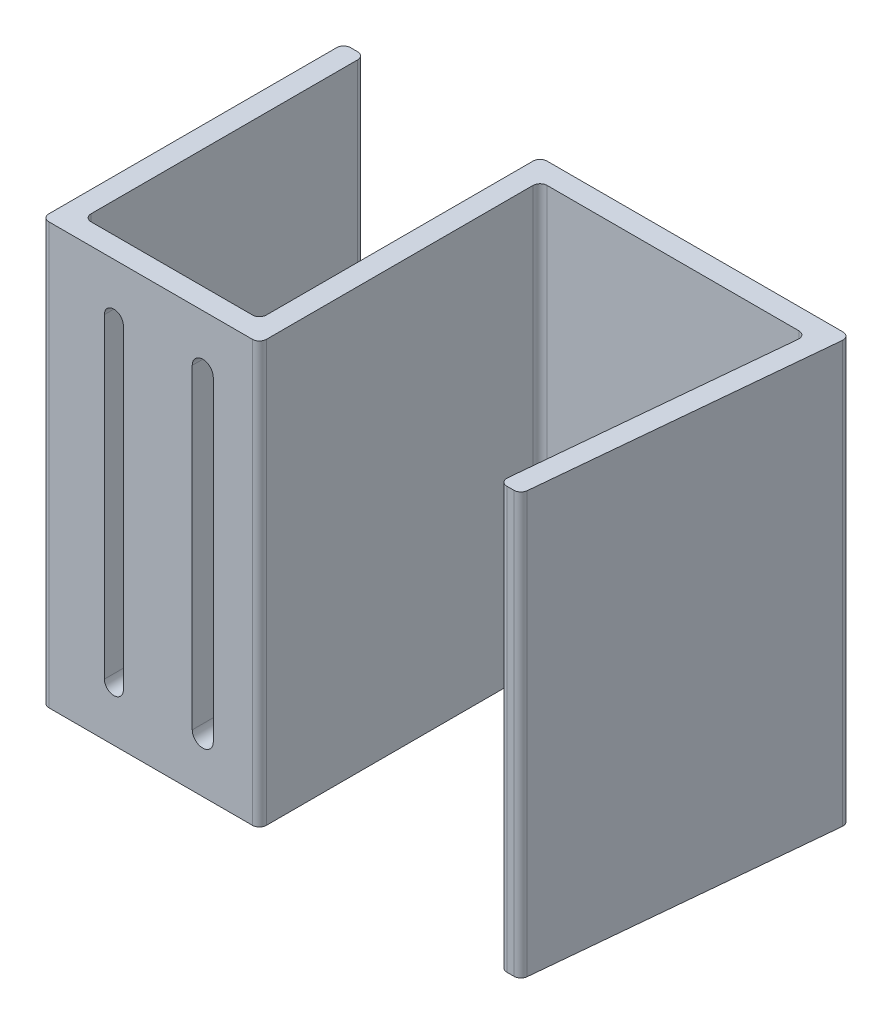
ISO-10303-21;
HEADER;
FILE_DESCRIPTION(('STEP AP214'),'2;1');
FILE_NAME('part.step','',(''),(''),'','','');
FILE_SCHEMA(('AUTOMOTIVE_DESIGN { 1 0 10303 214 1 1 1 1 }'));
ENDSEC;
DATA;
#1=APPLICATION_CONTEXT('core data for automotive mechanical design processes');
#2=APPLICATION_PROTOCOL_DEFINITION('international standard','automotive_design',2000,#1);
#3=PRODUCT_CONTEXT('',#1,'mechanical');
#4=PRODUCT('Part','Part','',(#3));
#5=PRODUCT_RELATED_PRODUCT_CATEGORY('part','',(#4));
#6=PRODUCT_DEFINITION_FORMATION('','',#4);
#7=PRODUCT_DEFINITION_CONTEXT('part definition',#1,'design');
#8=PRODUCT_DEFINITION('design','',#6,#7);
#9=PRODUCT_DEFINITION_SHAPE('','',#8);
#10=(LENGTH_UNIT() NAMED_UNIT(*) SI_UNIT(.MILLI.,.METRE.));
#11=(NAMED_UNIT(*) PLANE_ANGLE_UNIT() SI_UNIT($,.RADIAN.));
#12=(NAMED_UNIT(*) SI_UNIT($,.STERADIAN.) SOLID_ANGLE_UNIT());
#13=UNCERTAINTY_MEASURE_WITH_UNIT(LENGTH_MEASURE(1.E-05),#10,'distance_accuracy_value','');
#14=(GEOMETRIC_REPRESENTATION_CONTEXT(3) GLOBAL_UNCERTAINTY_ASSIGNED_CONTEXT((#13)) GLOBAL_UNIT_ASSIGNED_CONTEXT((#10,
#11,#12)) REPRESENTATION_CONTEXT('',''));
#15=CARTESIAN_POINT('',(0.,0.,0.));
#16=DIRECTION('',(0.,0.,1.));
#17=DIRECTION('',(1.,0.,0.));
#18=AXIS2_PLACEMENT_3D('',#15,#16,#17);
#19=CARTESIAN_POINT('',(-52.9607843137255,60.,19.5168179250331));
#20=DIRECTION('',(0.,0.,-1.));
#21=DIRECTION('',(-1.,0.,0.));
#22=AXIS2_PLACEMENT_3D('',#19,#20,#21);
#23=PLANE('',#22);
#24=DIRECTION('',(1.,0.,0.));
#25=VECTOR('',#24,1.);
#26=CARTESIAN_POINT('',(-52.9607843137255,60.,19.5168179250331));
#27=LINE('',#26,#25);
#28=CARTESIAN_POINT('',(-51.9607843137255,60.,19.5168179250331));
#29=VERTEX_POINT('',#28);
#30=CARTESIAN_POINT('',(-22.9607843137255,60.,19.5168179250331));
#31=VERTEX_POINT('',#30);
#32=EDGE_CURVE('E321',#29,#31,#27,.T.);
#33=ORIENTED_EDGE('',*,*,#32,.F.);
#34=DIRECTION('',(0.,-1.,0.));
#35=VECTOR('',#34,1.);
#36=CARTESIAN_POINT('',(-51.9607843137255,60.,19.5168179250331));
#37=LINE('',#36,#35);
#38=CARTESIAN_POINT('',(-51.9607843137255,0.,19.5168179250331));
#39=VERTEX_POINT('',#38);
#40=EDGE_CURVE('E461',#29,#39,#37,.T.);
#41=ORIENTED_EDGE('',*,*,#40,.T.);
#42=DIRECTION('',(1.,0.,0.));
#43=VECTOR('',#42,1.);
#44=CARTESIAN_POINT('',(-52.9607843137255,0.,19.5168179250331));
#45=LINE('',#44,#43);
#46=CARTESIAN_POINT('',(-22.9607843137255,0.,19.5168179250331));
#47=VERTEX_POINT('',#46);
#48=EDGE_CURVE('E320',#39,#47,#45,.T.);
#49=ORIENTED_EDGE('',*,*,#48,.T.);
#50=DIRECTION('',(0.,-1.,0.));
#51=VECTOR('',#50,1.);
#52=CARTESIAN_POINT('',(-22.9607843137255,60.,19.5168179250331));
#53=LINE('',#52,#51);
#54=EDGE_CURVE('E458',#47,#31,#53,.F.);
#55=ORIENTED_EDGE('',*,*,#54,.T.);
#56=EDGE_LOOP('',(#33,#41,#49,#55));
#57=FACE_BOUND('',#56,.T.);
#58=DIRECTION('',(0.,1.,0.));
#59=VECTOR('',#58,1.);
#60=CARTESIAN_POINT('',(-41.358290675916,60.,19.5168179250331));
#61=LINE('',#60,#59);
#62=CARTESIAN_POINT('',(-41.358290675916,7.5,19.5168179250331));
#63=VERTEX_POINT('',#62);
#64=CARTESIAN_POINT('',(-41.358290675916,52.5,19.5168179250331));
#65=VERTEX_POINT('',#64);
#66=EDGE_CURVE('E313',#63,#65,#61,.T.);
#67=ORIENTED_EDGE('',*,*,#66,.F.);
#68=CARTESIAN_POINT('',(-42.711362899011,7.5,19.5168179250331));
#69=DIRECTION('',(0.,0.,-1.));
#70=DIRECTION('',(-1.,0.,0.));
#71=AXIS2_PLACEMENT_3D('',#68,#69,#70);
#72=CIRCLE('',#71,1.353072223095);
#73=CARTESIAN_POINT('',(-44.064435122106,7.5,19.5168179250331));
#74=VERTEX_POINT('',#73);
#75=EDGE_CURVE('E316',#63,#74,#72,.T.);
#76=ORIENTED_EDGE('',*,*,#75,.T.);
#77=DIRECTION('',(0.,1.,0.));
#78=VECTOR('',#77,1.);
#79=CARTESIAN_POINT('',(-44.064435122106,60.,19.5168179250331));
#80=LINE('',#79,#78);
#81=CARTESIAN_POINT('',(-44.064435122106,52.5,19.5168179250331));
#82=VERTEX_POINT('',#81);
#83=EDGE_CURVE('E296',#74,#82,#80,.T.);
#84=ORIENTED_EDGE('',*,*,#83,.T.);
#85=CARTESIAN_POINT('',(-42.711362899011,52.5,19.5168179250331));
#86=DIRECTION('',(0.,0.,-1.));
#87=DIRECTION('',(-1.,0.,0.));
#88=AXIS2_PLACEMENT_3D('',#85,#86,#87);
#89=CIRCLE('',#88,1.353072223095);
#90=EDGE_CURVE('E309',#82,#65,#89,.T.);
#91=ORIENTED_EDGE('',*,*,#90,.T.);
#92=EDGE_LOOP('',(#67,#76,#84,#91));
#93=FACE_BOUND('',#92,.T.);
#94=CARTESIAN_POINT('',(-30.0386818856317,7.5,19.5168179250331));
#95=DIRECTION('',(0.,0.,-1.));
#96=DIRECTION('',(-1.,0.,0.));
#97=AXIS2_PLACEMENT_3D('',#94,#95,#96);
#98=CIRCLE('',#97,1.5);
#99=CARTESIAN_POINT('',(-31.5386818856317,7.5,19.5168179250331));
#100=VERTEX_POINT('',#99);
#101=CARTESIAN_POINT('',(-28.5386818856317,7.5,19.5168179250331));
#102=VERTEX_POINT('',#101);
#103=EDGE_CURVE('E271',#100,#102,#98,.F.);
#104=ORIENTED_EDGE('',*,*,#103,.F.);
#105=DIRECTION('',(0.,-1.,0.));
#106=VECTOR('',#105,1.);
#107=CARTESIAN_POINT('',(-31.5386818856317,60.,19.5168179250331));
#108=LINE('',#107,#106);
#109=CARTESIAN_POINT('',(-31.5386818856317,52.5,19.5168179250331));
#110=VERTEX_POINT('',#109);
#111=EDGE_CURVE('E267',#110,#100,#108,.T.);
#112=ORIENTED_EDGE('',*,*,#111,.F.);
#113=CARTESIAN_POINT('',(-30.0386818856317,52.5,19.5168179250331));
#114=DIRECTION('',(0.,0.,-1.));
#115=DIRECTION('',(-1.,0.,0.));
#116=AXIS2_PLACEMENT_3D('',#113,#114,#115);
#117=CIRCLE('',#116,1.5);
#118=CARTESIAN_POINT('',(-28.5386818856317,52.5,19.5168179250331));
#119=VERTEX_POINT('',#118);
#120=EDGE_CURVE('E253',#119,#110,#117,.F.);
#121=ORIENTED_EDGE('',*,*,#120,.F.);
#122=DIRECTION('',(0.,-1.,0.));
#123=VECTOR('',#122,1.);
#124=CARTESIAN_POINT('',(-28.5386818856317,60.,19.5168179250331));
#125=LINE('',#124,#123);
#126=EDGE_CURVE('E247',#119,#102,#125,.T.);
#127=ORIENTED_EDGE('',*,*,#126,.T.);
#128=EDGE_LOOP('',(#104,#112,#121,#127));
#129=FACE_BOUND('',#128,.T.);
#130=ADVANCED_FACE('F41',(#57,#93,#129),#23,.F.);
#131=CARTESIAN_POINT('',(-24.9607843137255,60.,16.5168179250331));
#132=DIRECTION('',(0.,0.,1.));
#133=DIRECTION('',(1.,0.,0.));
#134=AXIS2_PLACEMENT_3D('',#131,#132,#133);
#135=PLANE('',#134);
#136=DIRECTION('',(-1.,0.,0.));
#137=VECTOR('',#136,1.);
#138=CARTESIAN_POINT('',(-24.9607843137255,0.,16.5168179250331));
#139=LINE('',#138,#137);
#140=CARTESIAN_POINT('',(-25.9607843137255,0.,16.5168179250331));
#141=VERTEX_POINT('',#140);
#142=CARTESIAN_POINT('',(-48.9607843137255,0.,16.5168179250331));
#143=VERTEX_POINT('',#142);
#144=EDGE_CURVE('E402',#141,#143,#139,.T.);
#145=ORIENTED_EDGE('',*,*,#144,.T.);
#146=DIRECTION('',(0.,-1.,0.));
#147=VECTOR('',#146,1.);
#148=CARTESIAN_POINT('',(-48.9607843137255,60.,16.5168179250331));
#149=LINE('',#148,#147);
#150=CARTESIAN_POINT('',(-48.9607843137255,60.,16.5168179250331));
#151=VERTEX_POINT('',#150);
#152=EDGE_CURVE('E448',#143,#151,#149,.F.);
#153=ORIENTED_EDGE('',*,*,#152,.T.);
#154=DIRECTION('',(-1.,0.,0.));
#155=VECTOR('',#154,1.);
#156=CARTESIAN_POINT('',(-24.9607843137255,60.,16.5168179250331));
#157=LINE('',#156,#155);
#158=CARTESIAN_POINT('',(-25.9607843137255,60.,16.5168179250331));
#159=VERTEX_POINT('',#158);
#160=EDGE_CURVE('E354',#159,#151,#157,.T.);
#161=ORIENTED_EDGE('',*,*,#160,.F.);
#162=DIRECTION('',(0.,-1.,0.));
#163=VECTOR('',#162,1.);
#164=CARTESIAN_POINT('',(-25.9607843137255,0.,16.5168179250331));
#165=LINE('',#164,#163);
#166=EDGE_CURVE('E444',#159,#141,#165,.T.);
#167=ORIENTED_EDGE('',*,*,#166,.T.);
#168=EDGE_LOOP('',(#145,#153,#161,#167));
#169=FACE_BOUND('',#168,.T.);
#170=DIRECTION('',(0.,1.,0.));
#171=VECTOR('',#170,1.);
#172=CARTESIAN_POINT('',(-44.064435122106,7.5,16.5168179250331));
#173=LINE('',#172,#171);
#174=CARTESIAN_POINT('',(-44.064435122106,7.5,16.5168179250331));
#175=VERTEX_POINT('',#174);
#176=CARTESIAN_POINT('',(-44.064435122106,52.5,16.5168179250331));
#177=VERTEX_POINT('',#176);
#178=EDGE_CURVE('E280',#175,#177,#173,.T.);
#179=ORIENTED_EDGE('',*,*,#178,.F.);
#180=CARTESIAN_POINT('',(-42.711362899011,7.5,16.5168179250331));
#181=DIRECTION('',(0.,0.,-1.));
#182=DIRECTION('',(-1.,0.,0.));
#183=AXIS2_PLACEMENT_3D('',#180,#181,#182);
#184=CIRCLE('',#183,1.353072223095);
#185=CARTESIAN_POINT('',(-41.358290675916,7.5,16.5168179250331));
#186=VERTEX_POINT('',#185);
#187=EDGE_CURVE('E277',#186,#175,#184,.T.);
#188=ORIENTED_EDGE('',*,*,#187,.F.);
#189=DIRECTION('',(0.,1.,0.));
#190=VECTOR('',#189,1.);
#191=CARTESIAN_POINT('',(-41.358290675916,7.5,16.5168179250331));
#192=LINE('',#191,#190);
#193=CARTESIAN_POINT('',(-41.358290675916,52.5,16.5168179250331));
#194=VERTEX_POINT('',#193);
#195=EDGE_CURVE('E288',#186,#194,#192,.T.);
#196=ORIENTED_EDGE('',*,*,#195,.T.);
#197=CARTESIAN_POINT('',(-42.711362899011,52.5,16.5168179250331));
#198=DIRECTION('',(0.,0.,-1.));
#199=DIRECTION('',(-1.,0.,0.));
#200=AXIS2_PLACEMENT_3D('',#197,#198,#199);
#201=CIRCLE('',#200,1.353072223095);
#202=EDGE_CURVE('E284',#177,#194,#201,.T.);
#203=ORIENTED_EDGE('',*,*,#202,.F.);
#204=EDGE_LOOP('',(#179,#188,#196,#203));
#205=FACE_BOUND('',#204,.T.);
#206=CARTESIAN_POINT('',(-30.0386818856317,7.5,16.5168179250331));
#207=DIRECTION('',(0.,0.,1.));
#208=DIRECTION('',(1.,0.,0.));
#209=AXIS2_PLACEMENT_3D('',#206,#207,#208);
#210=CIRCLE('',#209,1.5);
#211=CARTESIAN_POINT('',(-28.5386818856317,7.5,16.5168179250331));
#212=VERTEX_POINT('',#211);
#213=CARTESIAN_POINT('',(-31.5386818856317,7.5,16.5168179250331));
#214=VERTEX_POINT('',#213);
#215=EDGE_CURVE('E12',#212,#214,#210,.F.);
#216=ORIENTED_EDGE('',*,*,#215,.F.);
#217=DIRECTION('',(0.,1.,0.));
#218=VECTOR('',#217,1.);
#219=CARTESIAN_POINT('',(-28.5386818856317,60.,16.5168179250331));
#220=LINE('',#219,#218);
#221=CARTESIAN_POINT('',(-28.5386818856317,52.5,16.5168179250331));
#222=VERTEX_POINT('',#221);
#223=EDGE_CURVE('E572',#212,#222,#220,.T.);
#224=ORIENTED_EDGE('',*,*,#223,.T.);
#225=CARTESIAN_POINT('',(-30.0386818856317,52.5,16.5168179250331));
#226=DIRECTION('',(0.,0.,1.));
#227=DIRECTION('',(1.,0.,0.));
#228=AXIS2_PLACEMENT_3D('',#225,#226,#227);
#229=CIRCLE('',#228,1.5);
#230=CARTESIAN_POINT('',(-31.5386818856317,52.5,16.5168179250331));
#231=VERTEX_POINT('',#230);
#232=EDGE_CURVE('E261',#231,#222,#229,.F.);
#233=ORIENTED_EDGE('',*,*,#232,.F.);
#234=DIRECTION('',(0.,1.,0.));
#235=VECTOR('',#234,1.);
#236=CARTESIAN_POINT('',(-31.5386818856317,60.,16.5168179250331));
#237=LINE('',#236,#235);
#238=EDGE_CURVE('E50',#214,#231,#237,.T.);
#239=ORIENTED_EDGE('',*,*,#238,.F.);
#240=EDGE_LOOP('',(#216,#224,#233,#239));
#241=FACE_BOUND('',#240,.T.);
#242=ADVANCED_FACE('F586',(#169,#205,#241),#135,.F.);
#243=CARTESIAN_POINT('',(-21.9607843137255,60.,19.5168179250331));
#244=DIRECTION('',(-1.,0.,0.));
#245=DIRECTION('',(0.,0.,1.));
#246=AXIS2_PLACEMENT_3D('',#243,#244,#245);
#247=PLANE('',#246);
#248=DIRECTION('',(0.,0.,-1.));
#249=VECTOR('',#248,1.);
#250=CARTESIAN_POINT('',(-21.9607843137255,0.,19.5168179250331));
#251=LINE('',#250,#249);
#252=CARTESIAN_POINT('',(-21.9607843137255,0.,18.5168179250331));
#253=VERTEX_POINT('',#252);
#254=CARTESIAN_POINT('',(-21.9607843137255,0.,-19.4831820749669));
#255=VERTEX_POINT('',#254);
#256=EDGE_CURVE('E374',#253,#255,#251,.T.);
#257=ORIENTED_EDGE('',*,*,#256,.T.);
#258=DIRECTION('',(0.,-1.,0.));
#259=VECTOR('',#258,1.);
#260=CARTESIAN_POINT('',(-21.9607843137255,60.,-19.4831820749669));
#261=LINE('',#260,#259);
#262=CARTESIAN_POINT('',(-21.9607843137255,60.,-19.4831820749669));
#263=VERTEX_POINT('',#262);
#264=EDGE_CURVE('E434',#255,#263,#261,.F.);
#265=ORIENTED_EDGE('',*,*,#264,.T.);
#266=DIRECTION('',(0.,0.,-1.));
#267=VECTOR('',#266,1.);
#268=CARTESIAN_POINT('',(-21.9607843137255,60.,19.5168179250331));
#269=LINE('',#268,#267);
#270=CARTESIAN_POINT('',(-21.9607843137255,60.,18.5168179250331));
#271=VERTEX_POINT('',#270);
#272=EDGE_CURVE('E325',#271,#263,#269,.T.);
#273=ORIENTED_EDGE('',*,*,#272,.F.);
#274=DIRECTION('',(0.,-1.,0.));
#275=VECTOR('',#274,1.);
#276=CARTESIAN_POINT('',(-21.9607843137255,60.,18.5168179250331));
#277=LINE('',#276,#275);
#278=EDGE_CURVE('E430',#271,#253,#277,.T.);
#279=ORIENTED_EDGE('',*,*,#278,.T.);
#280=EDGE_LOOP('',(#257,#265,#273,#279));
#281=FACE_BOUND('',#280,.T.);
#282=ADVANCED_FACE('F610',(#281),#247,.F.);
#283=CARTESIAN_POINT('',(-21.9607843137255,60.,-20.4831820749669));
#284=DIRECTION('',(0.,0.,-1.));
#285=DIRECTION('',(-1.,0.,0.));
#286=AXIS2_PLACEMENT_3D('',#283,#284,#285);
#287=PLANE('',#286);
#288=DIRECTION('',(1.,0.,0.));
#289=VECTOR('',#288,1.);
#290=CARTESIAN_POINT('',(-21.9607843137255,0.,-20.4831820749669));
#291=LINE('',#290,#289);
#292=CARTESIAN_POINT('',(-20.9607843137255,0.,-20.4831820749669));
#293=VERTEX_POINT('',#292);
#294=CARTESIAN_POINT('',(14.9392649412884,0.,-20.4831820749669));
#295=VERTEX_POINT('',#294);
#296=EDGE_CURVE('E378',#293,#295,#291,.T.);
#297=ORIENTED_EDGE('',*,*,#296,.T.);
#298=DIRECTION('',(0.,-1.,0.));
#299=VECTOR('',#298,1.);
#300=CARTESIAN_POINT('',(14.9392649412884,60.,-20.4831820749669));
#301=LINE('',#300,#299);
#302=CARTESIAN_POINT('',(14.9392649412884,60.,-20.4831820749669));
#303=VERTEX_POINT('',#302);
#304=EDGE_CURVE('E427',#295,#303,#301,.F.);
#305=ORIENTED_EDGE('',*,*,#304,.T.);
#306=DIRECTION('',(1.,0.,0.));
#307=VECTOR('',#306,1.);
#308=CARTESIAN_POINT('',(-21.9607843137255,60.,-20.4831820749669));
#309=LINE('',#308,#307);
#310=CARTESIAN_POINT('',(-20.9607843137255,60.,-20.4831820749669));
#311=VERTEX_POINT('',#310);
#312=EDGE_CURVE('E330',#311,#303,#309,.T.);
#313=ORIENTED_EDGE('',*,*,#312,.F.);
#314=DIRECTION('',(0.,-1.,0.));
#315=VECTOR('',#314,1.);
#316=CARTESIAN_POINT('',(-20.9607843137255,0.,-20.4831820749669));
#317=LINE('',#316,#315);
#318=EDGE_CURVE('E423',#311,#293,#317,.T.);
#319=ORIENTED_EDGE('',*,*,#318,.T.);
#320=EDGE_LOOP('',(#297,#305,#313,#319));
#321=FACE_BOUND('',#320,.T.);
#322=ADVANCED_FACE('F699',(#321),#287,.F.);
#323=CARTESIAN_POINT('',(16.0392156862745,60.,-20.4831820749669));
#324=DIRECTION('',(0.995479347839446,0.,0.0949782502742146));
#325=DIRECTION('',(0.0949782502742146,0.,-0.995479347839446));
#326=AXIS2_PLACEMENT_3D('',#323,#324,#325);
#327=PLANE('',#326);
#328=DIRECTION('',(-0.0949782502742146,0.,0.995479347839446));
#329=VECTOR('',#328,1.);
#330=CARTESIAN_POINT('',(16.0392156862745,60.,-20.4831820749669));
#331=LINE('',#330,#329);
#332=CARTESIAN_POINT('',(15.9347442891279,60.,-19.3882038246927));
#333=VERTEX_POINT('',#332);
#334=CARTESIAN_POINT('',(12.3273045344369,60.,18.4218396747588));
#335=VERTEX_POINT('',#334);
#336=EDGE_CURVE('E334',#333,#335,#331,.T.);
#337=ORIENTED_EDGE('',*,*,#336,.F.);
#338=DIRECTION('',(0.,-1.,0.));
#339=VECTOR('',#338,1.);
#340=CARTESIAN_POINT('',(15.9347442891279,0.,-19.3882038246927));
#341=LINE('',#340,#339);
#342=CARTESIAN_POINT('',(15.9347442891279,0.,-19.3882038246927));
#343=VERTEX_POINT('',#342);
#344=EDGE_CURVE('E419',#333,#343,#341,.T.);
#345=ORIENTED_EDGE('',*,*,#344,.T.);
#346=DIRECTION('',(-0.0949782502742146,0.,0.995479347839446));
#347=VECTOR('',#346,1.);
#348=CARTESIAN_POINT('',(16.0392156862745,0.,-20.4831820749669));
#349=LINE('',#348,#347);
#350=CARTESIAN_POINT('',(12.3273045344369,0.,18.4218396747588));
#351=VERTEX_POINT('',#350);
#352=EDGE_CURVE('E382',#343,#351,#349,.T.);
#353=ORIENTED_EDGE('',*,*,#352,.T.);
#354=DIRECTION('',(0.,-1.,0.));
#355=VECTOR('',#354,1.);
#356=CARTESIAN_POINT('',(12.3273045344369,60.,18.4218396747588));
#357=LINE('',#356,#355);
#358=EDGE_CURVE('E370',#351,#335,#357,.F.);
#359=ORIENTED_EDGE('',*,*,#358,.T.);
#360=EDGE_LOOP('',(#337,#345,#353,#359));
#361=FACE_BOUND('',#360,.T.);
#362=ADVANCED_FACE('F706',(#361),#327,.F.);
#363=CARTESIAN_POINT('',(12.2228331372903,60.,19.5168179250331));
#364=DIRECTION('',(0.,0.,-1.));
#365=DIRECTION('',(-1.,0.,0.));
#366=AXIS2_PLACEMENT_3D('',#363,#364,#365);
#367=PLANE('',#366);
#368=DIRECTION('',(1.,0.,0.));
#369=VECTOR('',#368,1.);
#370=CARTESIAN_POINT('',(12.2228331372903,0.,19.5168179250331));
#371=LINE('',#370,#369);
#372=CARTESIAN_POINT('',(13.3227838822764,0.,19.5168179250331));
#373=VERTEX_POINT('',#372);
#374=CARTESIAN_POINT('',(14.3137015197535,0.,19.5168179250331));
#375=VERTEX_POINT('',#374);
#376=EDGE_CURVE('E386',#373,#375,#371,.T.);
#377=ORIENTED_EDGE('',*,*,#376,.T.);
#378=DIRECTION('',(0.,-1.,0.));
#379=VECTOR('',#378,1.);
#380=CARTESIAN_POINT('',(14.3137015197535,60.,19.5168179250331));
#381=LINE('',#380,#379);
#382=CARTESIAN_POINT('',(14.3137015197535,60.,19.5168179250331));
#383=VERTEX_POINT('',#382);
#384=EDGE_CURVE('E531',#375,#383,#381,.F.);
#385=ORIENTED_EDGE('',*,*,#384,.T.);
#386=DIRECTION('',(1.,0.,0.));
#387=VECTOR('',#386,1.);
#388=CARTESIAN_POINT('',(12.2228331372903,60.,19.5168179250331));
#389=LINE('',#388,#387);
#390=CARTESIAN_POINT('',(13.3227838822764,60.,19.5168179250331));
#391=VERTEX_POINT('',#390);
#392=EDGE_CURVE('E338',#391,#383,#389,.T.);
#393=ORIENTED_EDGE('',*,*,#392,.F.);
#394=DIRECTION('',(0.,-1.,0.));
#395=VECTOR('',#394,1.);
#396=CARTESIAN_POINT('',(13.3227838822764,60.,19.5168179250331));
#397=LINE('',#396,#395);
#398=EDGE_CURVE('E527',#391,#373,#397,.T.);
#399=ORIENTED_EDGE('',*,*,#398,.T.);
#400=EDGE_LOOP('',(#377,#385,#393,#399));
#401=FACE_BOUND('',#400,.T.);
#402=ADVANCED_FACE('F713',(#401),#367,.F.);
#403=CARTESIAN_POINT('',(15.2228331372903,60.,19.5168179250331));
#404=DIRECTION('',(-0.995479347839446,0.,-0.0949782502742145));
#405=DIRECTION('',(-0.0949782502742145,0.,0.995479347839446));
#406=AXIS2_PLACEMENT_3D('',#403,#404,#405);
#407=PLANE('',#406);
#408=DIRECTION('',(0.0949782502742145,0.,-0.995479347839446));
#409=VECTOR('',#408,1.);
#410=CARTESIAN_POINT('',(15.2228331372903,60.,19.5168179250331));
#411=LINE('',#410,#409);
#412=CARTESIAN_POINT('',(15.309180867593,60.,18.6117961753073));
#413=VERTEX_POINT('',#412);
#414=CARTESIAN_POINT('',(19.2209729803017,60.,-22.3882038246927));
#415=VERTEX_POINT('',#414);
#416=EDGE_CURVE('E342',#413,#415,#411,.T.);
#417=ORIENTED_EDGE('',*,*,#416,.F.);
#418=DIRECTION('',(0.,-1.,0.));
#419=VECTOR('',#418,1.);
#420=CARTESIAN_POINT('',(15.309180867593,60.,18.6117961753073));
#421=LINE('',#420,#419);
#422=CARTESIAN_POINT('',(15.309180867593,0.,18.6117961753073));
#423=VERTEX_POINT('',#422);
#424=EDGE_CURVE('E523',#413,#423,#421,.T.);
#425=ORIENTED_EDGE('',*,*,#424,.T.);
#426=DIRECTION('',(0.0949782502742145,0.,-0.995479347839446));
#427=VECTOR('',#426,1.);
#428=CARTESIAN_POINT('',(15.2228331372903,0.,19.5168179250331));
#429=LINE('',#428,#427);
#430=CARTESIAN_POINT('',(19.2209729803017,0.,-22.3882038246927));
#431=VERTEX_POINT('',#430);
#432=EDGE_CURVE('E390',#423,#431,#429,.T.);
#433=ORIENTED_EDGE('',*,*,#432,.T.);
#434=DIRECTION('',(0.,-1.,0.));
#435=VECTOR('',#434,1.);
#436=CARTESIAN_POINT('',(19.2209729803017,60.,-22.3882038246927));
#437=LINE('',#436,#435);
#438=EDGE_CURVE('E520',#431,#415,#437,.F.);
#439=ORIENTED_EDGE('',*,*,#438,.T.);
#440=EDGE_LOOP('',(#417,#425,#433,#439));
#441=FACE_BOUND('',#440,.T.);
#442=ADVANCED_FACE('F720',(#441),#407,.F.);
#443=CARTESIAN_POINT('',(19.3254443774483,60.,-23.4831820749669));
#444=DIRECTION('',(0.,0.,1.));
#445=DIRECTION('',(1.,0.,0.));
#446=AXIS2_PLACEMENT_3D('',#443,#444,#445);
#447=PLANE('',#446);
#448=DIRECTION('',(-1.,0.,0.));
#449=VECTOR('',#448,1.);
#450=CARTESIAN_POINT('',(19.3254443774483,60.,-23.4831820749669));
#451=LINE('',#450,#449);
#452=CARTESIAN_POINT('',(18.2254936324623,60.,-23.4831820749669));
#453=VERTEX_POINT('',#452);
#454=CARTESIAN_POINT('',(-23.9607843137255,60.,-23.4831820749669));
#455=VERTEX_POINT('',#454);
#456=EDGE_CURVE('E346',#453,#455,#451,.T.);
#457=ORIENTED_EDGE('',*,*,#456,.F.);
#458=DIRECTION('',(0.,-1.,0.));
#459=VECTOR('',#458,1.);
#460=CARTESIAN_POINT('',(18.2254936324623,60.,-23.4831820749669));
#461=LINE('',#460,#459);
#462=CARTESIAN_POINT('',(18.2254936324623,0.,-23.4831820749669));
#463=VERTEX_POINT('',#462);
#464=EDGE_CURVE('E537',#453,#463,#461,.T.);
#465=ORIENTED_EDGE('',*,*,#464,.T.);
#466=DIRECTION('',(-1.,0.,0.));
#467=VECTOR('',#466,1.);
#468=CARTESIAN_POINT('',(19.3254443774483,0.,-23.4831820749669));
#469=LINE('',#468,#467);
#470=CARTESIAN_POINT('',(-23.9607843137255,0.,-23.4831820749669));
#471=VERTEX_POINT('',#470);
#472=EDGE_CURVE('E394',#463,#471,#469,.T.);
#473=ORIENTED_EDGE('',*,*,#472,.T.);
#474=DIRECTION('',(0.,-1.,0.));
#475=VECTOR('',#474,1.);
#476=CARTESIAN_POINT('',(-23.9607843137255,60.,-23.4831820749669));
#477=LINE('',#476,#475);
#478=EDGE_CURVE('E534',#471,#455,#477,.F.);
#479=ORIENTED_EDGE('',*,*,#478,.T.);
#480=EDGE_LOOP('',(#457,#465,#473,#479));
#481=FACE_BOUND('',#480,.T.);
#482=ADVANCED_FACE('F727',(#481),#447,.F.);
#483=CARTESIAN_POINT('',(-24.9607843137255,60.,-23.4831820749669));
#484=DIRECTION('',(1.,0.,0.));
#485=DIRECTION('',(0.,0.,-1.));
#486=AXIS2_PLACEMENT_3D('',#483,#484,#485);
#487=PLANE('',#486);
#488=DIRECTION('',(0.,0.,1.));
#489=VECTOR('',#488,1.);
#490=CARTESIAN_POINT('',(-24.9607843137255,0.,-23.4831820749669));
#491=LINE('',#490,#489);
#492=CARTESIAN_POINT('',(-24.9607843137255,0.,-22.4831820749669));
#493=VERTEX_POINT('',#492);
#494=CARTESIAN_POINT('',(-24.9607843137255,0.,15.5168179250331));
#495=VERTEX_POINT('',#494);
#496=EDGE_CURVE('E398',#493,#495,#491,.T.);
#497=ORIENTED_EDGE('',*,*,#496,.T.);
#498=DIRECTION('',(0.,-1.,0.));
#499=VECTOR('',#498,1.);
#500=CARTESIAN_POINT('',(-24.9607843137255,60.,15.5168179250331));
#501=LINE('',#500,#499);
#502=CARTESIAN_POINT('',(-24.9607843137255,60.,15.5168179250331));
#503=VERTEX_POINT('',#502);
#504=EDGE_CURVE('E455',#495,#503,#501,.F.);
#505=ORIENTED_EDGE('',*,*,#504,.T.);
#506=DIRECTION('',(0.,0.,1.));
#507=VECTOR('',#506,1.);
#508=CARTESIAN_POINT('',(-24.9607843137255,60.,-23.4831820749669));
#509=LINE('',#508,#507);
#510=CARTESIAN_POINT('',(-24.9607843137255,60.,-22.4831820749669));
#511=VERTEX_POINT('',#510);
#512=EDGE_CURVE('E350',#511,#503,#509,.T.);
#513=ORIENTED_EDGE('',*,*,#512,.F.);
#514=DIRECTION('',(0.,-1.,0.));
#515=VECTOR('',#514,1.);
#516=CARTESIAN_POINT('',(-24.9607843137255,60.,-22.4831820749669));
#517=LINE('',#516,#515);
#518=EDGE_CURVE('E451',#511,#493,#517,.T.);
#519=ORIENTED_EDGE('',*,*,#518,.T.);
#520=EDGE_LOOP('',(#497,#505,#513,#519));
#521=FACE_BOUND('',#520,.T.);
#522=ADVANCED_FACE('F734',(#521),#487,.F.);
#523=CARTESIAN_POINT('',(-49.9607843137255,60.,16.5168179250331));
#524=DIRECTION('',(-1.,0.,0.));
#525=DIRECTION('',(0.,0.,1.));
#526=AXIS2_PLACEMENT_3D('',#523,#524,#525);
#527=PLANE('',#526);
#528=DIRECTION('',(0.,0.,-1.));
#529=VECTOR('',#528,1.);
#530=CARTESIAN_POINT('',(-49.9607843137255,60.,16.5168179250331));
#531=LINE('',#530,#529);
#532=CARTESIAN_POINT('',(-49.9607843137255,60.,15.5168179250331));
#533=VERTEX_POINT('',#532);
#534=CARTESIAN_POINT('',(-49.9607843137255,60.,-22.4831820749669));
#535=VERTEX_POINT('',#534);
#536=EDGE_CURVE('E358',#533,#535,#531,.T.);
#537=ORIENTED_EDGE('',*,*,#536,.F.);
#538=DIRECTION('',(0.,-1.,0.));
#539=VECTOR('',#538,1.);
#540=CARTESIAN_POINT('',(-49.9607843137255,0.,15.5168179250331));
#541=LINE('',#540,#539);
#542=CARTESIAN_POINT('',(-49.9607843137255,0.,15.5168179250331));
#543=VERTEX_POINT('',#542);
#544=EDGE_CURVE('E440',#533,#543,#541,.T.);
#545=ORIENTED_EDGE('',*,*,#544,.T.);
#546=DIRECTION('',(0.,0.,-1.));
#547=VECTOR('',#546,1.);
#548=CARTESIAN_POINT('',(-49.9607843137255,0.,16.5168179250331));
#549=LINE('',#548,#547);
#550=CARTESIAN_POINT('',(-49.9607843137255,0.,-22.4831820749669));
#551=VERTEX_POINT('',#550);
#552=EDGE_CURVE('E406',#543,#551,#549,.T.);
#553=ORIENTED_EDGE('',*,*,#552,.T.);
#554=DIRECTION('',(0.,-1.,0.));
#555=VECTOR('',#554,1.);
#556=CARTESIAN_POINT('',(-49.9607843137255,60.,-22.4831820749669));
#557=LINE('',#556,#555);
#558=EDGE_CURVE('E437',#551,#535,#557,.F.);
#559=ORIENTED_EDGE('',*,*,#558,.T.);
#560=EDGE_LOOP('',(#537,#545,#553,#559));
#561=FACE_BOUND('',#560,.T.);
#562=ADVANCED_FACE('F745',(#561),#527,.F.);
#563=CARTESIAN_POINT('',(-49.9607843137255,60.,-23.4831820749669));
#564=DIRECTION('',(0.,0.,1.));
#565=DIRECTION('',(1.,0.,0.));
#566=AXIS2_PLACEMENT_3D('',#563,#564,#565);
#567=PLANE('',#566);
#568=DIRECTION('',(-1.,0.,0.));
#569=VECTOR('',#568,1.);
#570=CARTESIAN_POINT('',(-49.9607843137255,60.,-23.4831820749669));
#571=LINE('',#570,#569);
#572=CARTESIAN_POINT('',(-50.9607843137255,60.,-23.4831820749669));
#573=VERTEX_POINT('',#572);
#574=CARTESIAN_POINT('',(-51.9607843137255,60.,-23.4831820749669));
#575=VERTEX_POINT('',#574);
#576=EDGE_CURVE('E362',#573,#575,#571,.T.);
#577=ORIENTED_EDGE('',*,*,#576,.F.);
#578=DIRECTION('',(0.,-1.,0.));
#579=VECTOR('',#578,1.);
#580=CARTESIAN_POINT('',(-50.9607843137255,60.,-23.4831820749669));
#581=LINE('',#580,#579);
#582=CARTESIAN_POINT('',(-50.9607843137255,0.,-23.4831820749669));
#583=VERTEX_POINT('',#582);
#584=EDGE_CURVE('E544',#573,#583,#581,.T.);
#585=ORIENTED_EDGE('',*,*,#584,.T.);
#586=DIRECTION('',(-1.,0.,0.));
#587=VECTOR('',#586,1.);
#588=CARTESIAN_POINT('',(-49.9607843137255,0.,-23.4831820749669));
#589=LINE('',#588,#587);
#590=CARTESIAN_POINT('',(-51.9607843137255,0.,-23.4831820749669));
#591=VERTEX_POINT('',#590);
#592=EDGE_CURVE('E410',#583,#591,#589,.T.);
#593=ORIENTED_EDGE('',*,*,#592,.T.);
#594=DIRECTION('',(0.,-1.,0.));
#595=VECTOR('',#594,1.);
#596=CARTESIAN_POINT('',(-51.9607843137255,60.,-23.4831820749669));
#597=LINE('',#596,#595);
#598=EDGE_CURVE('E541',#591,#575,#597,.F.);
#599=ORIENTED_EDGE('',*,*,#598,.T.);
#600=EDGE_LOOP('',(#577,#585,#593,#599));
#601=FACE_BOUND('',#600,.T.);
#602=ADVANCED_FACE('F675',(#601),#567,.F.);
#603=CARTESIAN_POINT('',(-52.9607843137255,60.,-23.4831820749669));
#604=DIRECTION('',(1.,0.,0.));
#605=DIRECTION('',(0.,0.,-1.));
#606=AXIS2_PLACEMENT_3D('',#603,#604,#605);
#607=PLANE('',#606);
#608=DIRECTION('',(0.,0.,1.));
#609=VECTOR('',#608,1.);
#610=CARTESIAN_POINT('',(-52.9607843137255,0.,-23.4831820749669));
#611=LINE('',#610,#609);
#612=CARTESIAN_POINT('',(-52.9607843137255,0.,-22.4831820749669));
#613=VERTEX_POINT('',#612);
#614=CARTESIAN_POINT('',(-52.9607843137255,0.,18.5168179250331));
#615=VERTEX_POINT('',#614);
#616=EDGE_CURVE('E326',#613,#615,#611,.T.);
#617=ORIENTED_EDGE('',*,*,#616,.T.);
#618=DIRECTION('',(0.,-1.,0.));
#619=VECTOR('',#618,1.);
#620=CARTESIAN_POINT('',(-52.9607843137255,60.,18.5168179250331));
#621=LINE('',#620,#619);
#622=CARTESIAN_POINT('',(-52.9607843137255,60.,18.5168179250331));
#623=VERTEX_POINT('',#622);
#624=EDGE_CURVE('E493',#615,#623,#621,.F.);
#625=ORIENTED_EDGE('',*,*,#624,.T.);
#626=DIRECTION('',(0.,0.,1.));
#627=VECTOR('',#626,1.);
#628=CARTESIAN_POINT('',(-52.9607843137255,60.,-23.4831820749669));
#629=LINE('',#628,#627);
#630=CARTESIAN_POINT('',(-52.9607843137255,60.,-22.4831820749669));
#631=VERTEX_POINT('',#630);
#632=EDGE_CURVE('E366',#631,#623,#629,.T.);
#633=ORIENTED_EDGE('',*,*,#632,.F.);
#634=DIRECTION('',(0.,-1.,0.));
#635=VECTOR('',#634,1.);
#636=CARTESIAN_POINT('',(-52.9607843137255,60.,-22.4831820749669));
#637=LINE('',#636,#635);
#638=EDGE_CURVE('E489',#631,#613,#637,.T.);
#639=ORIENTED_EDGE('',*,*,#638,.T.);
#640=EDGE_LOOP('',(#617,#625,#633,#639));
#641=FACE_BOUND('',#640,.T.);
#642=ADVANCED_FACE('F682',(#641),#607,.F.);
#643=CARTESIAN_POINT('',(0.,60.,0.));
#644=DIRECTION('',(0.,1.,0.));
#645=DIRECTION('',(0.,0.,1.));
#646=AXIS2_PLACEMENT_3D('',#643,#644,#645);
#647=PLANE('',#646);
#648=ORIENTED_EDGE('',*,*,#632,.T.);
#649=CARTESIAN_POINT('',(-51.9607843137255,60.,18.5168179250331));
#650=DIRECTION('',(0.,1.,0.));
#651=DIRECTION('',(0.,0.,1.));
#652=AXIS2_PLACEMENT_3D('',#649,#650,#651);
#653=CIRCLE('',#652,1.);
#654=EDGE_CURVE('E517',#623,#29,#653,.T.);
#655=ORIENTED_EDGE('',*,*,#654,.T.);
#656=ORIENTED_EDGE('',*,*,#32,.T.);
#657=CARTESIAN_POINT('',(-22.9607843137255,60.,18.5168179250331));
#658=DIRECTION('',(0.,1.,0.));
#659=DIRECTION('',(0.,0.,1.));
#660=AXIS2_PLACEMENT_3D('',#657,#658,#659);
#661=CIRCLE('',#660,1.);
#662=EDGE_CURVE('E514',#31,#271,#661,.T.);
#663=ORIENTED_EDGE('',*,*,#662,.T.);
#664=ORIENTED_EDGE('',*,*,#272,.T.);
#665=CARTESIAN_POINT('',(-20.9607843137255,60.,-19.4831820749669));
#666=DIRECTION('',(0.,1.,0.));
#667=DIRECTION('',(0.,0.,1.));
#668=AXIS2_PLACEMENT_3D('',#665,#666,#667);
#669=CIRCLE('',#668,1.);
#670=EDGE_CURVE('E557',#263,#311,#669,.F.);
#671=ORIENTED_EDGE('',*,*,#670,.T.);
#672=ORIENTED_EDGE('',*,*,#312,.T.);
#673=CARTESIAN_POINT('',(14.9392649412884,60.,-19.4831820749669));
#674=DIRECTION('',(0.,1.,0.));
#675=DIRECTION('',(0.,0.,1.));
#676=AXIS2_PLACEMENT_3D('',#673,#674,#675);
#677=CIRCLE('',#676,1.);
#678=EDGE_CURVE('E551',#303,#333,#677,.F.);
#679=ORIENTED_EDGE('',*,*,#678,.T.);
#680=ORIENTED_EDGE('',*,*,#336,.T.);
#681=CARTESIAN_POINT('',(13.3227838822764,60.,18.5168179250331));
#682=DIRECTION('',(0.,1.,0.));
#683=DIRECTION('',(0.,0.,1.));
#684=AXIS2_PLACEMENT_3D('',#681,#682,#683);
#685=CIRCLE('',#684,1.);
#686=EDGE_CURVE('E508',#335,#391,#685,.T.);
#687=ORIENTED_EDGE('',*,*,#686,.T.);
#688=ORIENTED_EDGE('',*,*,#392,.T.);
#689=CARTESIAN_POINT('',(14.3137015197535,60.,18.5168179250331));
#690=DIRECTION('',(0.,1.,0.));
#691=DIRECTION('',(0.,0.,1.));
#692=AXIS2_PLACEMENT_3D('',#689,#690,#691);
#693=CIRCLE('',#692,1.);
#694=EDGE_CURVE('E511',#383,#413,#693,.T.);
#695=ORIENTED_EDGE('',*,*,#694,.T.);
#696=ORIENTED_EDGE('',*,*,#416,.T.);
#697=CARTESIAN_POINT('',(18.2254936324623,60.,-22.4831820749669));
#698=DIRECTION('',(0.,1.,0.));
#699=DIRECTION('',(0.,0.,1.));
#700=AXIS2_PLACEMENT_3D('',#697,#698,#699);
#701=CIRCLE('',#700,1.);
#702=EDGE_CURVE('E505',#415,#453,#701,.T.);
#703=ORIENTED_EDGE('',*,*,#702,.T.);
#704=ORIENTED_EDGE('',*,*,#456,.T.);
#705=CARTESIAN_POINT('',(-23.9607843137255,60.,-22.4831820749669));
#706=DIRECTION('',(0.,1.,0.));
#707=DIRECTION('',(0.,0.,1.));
#708=AXIS2_PLACEMENT_3D('',#705,#706,#707);
#709=CIRCLE('',#708,1.);
#710=EDGE_CURVE('E502',#455,#511,#709,.T.);
#711=ORIENTED_EDGE('',*,*,#710,.T.);
#712=ORIENTED_EDGE('',*,*,#512,.T.);
#713=CARTESIAN_POINT('',(-25.9607843137255,60.,15.5168179250331));
#714=DIRECTION('',(0.,1.,0.));
#715=DIRECTION('',(0.,0.,1.));
#716=AXIS2_PLACEMENT_3D('',#713,#714,#715);
#717=CIRCLE('',#716,1.);
#718=EDGE_CURVE('E569',#503,#159,#717,.F.);
#719=ORIENTED_EDGE('',*,*,#718,.T.);
#720=ORIENTED_EDGE('',*,*,#160,.T.);
#721=CARTESIAN_POINT('',(-48.9607843137255,60.,15.5168179250331));
#722=DIRECTION('',(0.,1.,0.));
#723=DIRECTION('',(0.,0.,1.));
#724=AXIS2_PLACEMENT_3D('',#721,#722,#723);
#725=CIRCLE('',#724,1.);
#726=EDGE_CURVE('E563',#151,#533,#725,.F.);
#727=ORIENTED_EDGE('',*,*,#726,.T.);
#728=ORIENTED_EDGE('',*,*,#536,.T.);
#729=CARTESIAN_POINT('',(-50.9607843137255,60.,-22.4831820749669));
#730=DIRECTION('',(0.,1.,0.));
#731=DIRECTION('',(0.,0.,1.));
#732=AXIS2_PLACEMENT_3D('',#729,#730,#731);
#733=CIRCLE('',#732,1.);
#734=EDGE_CURVE('E499',#535,#573,#733,.T.);
#735=ORIENTED_EDGE('',*,*,#734,.T.);
#736=ORIENTED_EDGE('',*,*,#576,.T.);
#737=CARTESIAN_POINT('',(-51.9607843137255,60.,-22.4831820749669));
#738=DIRECTION('',(0.,1.,0.));
#739=DIRECTION('',(0.,0.,1.));
#740=AXIS2_PLACEMENT_3D('',#737,#738,#739);
#741=CIRCLE('',#740,1.);
#742=EDGE_CURVE('E496',#575,#631,#741,.T.);
#743=ORIENTED_EDGE('',*,*,#742,.T.);
#744=EDGE_LOOP('',(#648,#655,#656,#663,#664,#671,#672,#679,#680,#687,#688,#695,#696,#703,#704,
#711,#712,#719,#720,#727,#728,#735,#736,#743));
#745=FACE_BOUND('',#744,.T.);
#746=ADVANCED_FACE('F671',(#745),#647,.T.);
#747=CARTESIAN_POINT('',(0.,0.,0.));
#748=DIRECTION('',(0.,1.,0.));
#749=DIRECTION('',(0.,0.,1.));
#750=AXIS2_PLACEMENT_3D('',#747,#748,#749);
#751=PLANE('',#750);
#752=ORIENTED_EDGE('',*,*,#48,.F.);
#753=CARTESIAN_POINT('',(-51.9607843137255,0.,18.5168179250331));
#754=DIRECTION('',(0.,1.,0.));
#755=DIRECTION('',(0.,0.,1.));
#756=AXIS2_PLACEMENT_3D('',#753,#754,#755);
#757=CIRCLE('',#756,1.);
#758=EDGE_CURVE('E486',#39,#615,#757,.F.);
#759=ORIENTED_EDGE('',*,*,#758,.T.);
#760=ORIENTED_EDGE('',*,*,#616,.F.);
#761=CARTESIAN_POINT('',(-51.9607843137255,0.,-22.4831820749669));
#762=DIRECTION('',(0.,1.,0.));
#763=DIRECTION('',(0.,0.,1.));
#764=AXIS2_PLACEMENT_3D('',#761,#762,#763);
#765=CIRCLE('',#764,1.);
#766=EDGE_CURVE('E465',#613,#591,#765,.F.);
#767=ORIENTED_EDGE('',*,*,#766,.T.);
#768=ORIENTED_EDGE('',*,*,#592,.F.);
#769=CARTESIAN_POINT('',(-50.9607843137255,0.,-22.4831820749669));
#770=DIRECTION('',(0.,1.,0.));
#771=DIRECTION('',(0.,0.,1.));
#772=AXIS2_PLACEMENT_3D('',#769,#770,#771);
#773=CIRCLE('',#772,1.);
#774=EDGE_CURVE('E468',#583,#551,#773,.F.);
#775=ORIENTED_EDGE('',*,*,#774,.T.);
#776=ORIENTED_EDGE('',*,*,#552,.F.);
#777=CARTESIAN_POINT('',(-48.9607843137255,0.,15.5168179250331));
#778=DIRECTION('',(0.,1.,0.));
#779=DIRECTION('',(0.,0.,1.));
#780=AXIS2_PLACEMENT_3D('',#777,#778,#779);
#781=CIRCLE('',#780,1.);
#782=EDGE_CURVE('E560',#543,#143,#781,.T.);
#783=ORIENTED_EDGE('',*,*,#782,.T.);
#784=ORIENTED_EDGE('',*,*,#144,.F.);
#785=CARTESIAN_POINT('',(-25.9607843137255,0.,15.5168179250331));
#786=DIRECTION('',(0.,1.,0.));
#787=DIRECTION('',(0.,0.,1.));
#788=AXIS2_PLACEMENT_3D('',#785,#786,#787);
#789=CIRCLE('',#788,1.);
#790=EDGE_CURVE('E566',#141,#495,#789,.T.);
#791=ORIENTED_EDGE('',*,*,#790,.T.);
#792=ORIENTED_EDGE('',*,*,#496,.F.);
#793=CARTESIAN_POINT('',(-23.9607843137255,0.,-22.4831820749669));
#794=DIRECTION('',(0.,1.,0.));
#795=DIRECTION('',(0.,0.,1.));
#796=AXIS2_PLACEMENT_3D('',#793,#794,#795);
#797=CIRCLE('',#796,1.);
#798=EDGE_CURVE('E471',#493,#471,#797,.F.);
#799=ORIENTED_EDGE('',*,*,#798,.T.);
#800=ORIENTED_EDGE('',*,*,#472,.F.);
#801=CARTESIAN_POINT('',(18.2254936324623,0.,-22.4831820749669));
#802=DIRECTION('',(0.,1.,0.));
#803=DIRECTION('',(0.,0.,1.));
#804=AXIS2_PLACEMENT_3D('',#801,#802,#803);
#805=CIRCLE('',#804,1.);
#806=EDGE_CURVE('E474',#463,#431,#805,.F.);
#807=ORIENTED_EDGE('',*,*,#806,.T.);
#808=ORIENTED_EDGE('',*,*,#432,.F.);
#809=CARTESIAN_POINT('',(14.3137015197535,0.,18.5168179250331));
#810=DIRECTION('',(0.,1.,0.));
#811=DIRECTION('',(0.,0.,1.));
#812=AXIS2_PLACEMENT_3D('',#809,#810,#811);
#813=CIRCLE('',#812,1.);
#814=EDGE_CURVE('E480',#423,#375,#813,.F.);
#815=ORIENTED_EDGE('',*,*,#814,.T.);
#816=ORIENTED_EDGE('',*,*,#376,.F.);
#817=CARTESIAN_POINT('',(13.3227838822764,0.,18.5168179250331));
#818=DIRECTION('',(0.,1.,0.));
#819=DIRECTION('',(0.,0.,1.));
#820=AXIS2_PLACEMENT_3D('',#817,#818,#819);
#821=CIRCLE('',#820,1.);
#822=EDGE_CURVE('E477',#373,#351,#821,.F.);
#823=ORIENTED_EDGE('',*,*,#822,.T.);
#824=ORIENTED_EDGE('',*,*,#352,.F.);
#825=CARTESIAN_POINT('',(14.9392649412884,0.,-19.4831820749669));
#826=DIRECTION('',(0.,1.,0.));
#827=DIRECTION('',(0.,0.,1.));
#828=AXIS2_PLACEMENT_3D('',#825,#826,#827);
#829=CIRCLE('',#828,1.);
#830=EDGE_CURVE('E548',#343,#295,#829,.T.);
#831=ORIENTED_EDGE('',*,*,#830,.T.);
#832=ORIENTED_EDGE('',*,*,#296,.F.);
#833=CARTESIAN_POINT('',(-20.9607843137255,0.,-19.4831820749669));
#834=DIRECTION('',(0.,1.,0.));
#835=DIRECTION('',(0.,0.,1.));
#836=AXIS2_PLACEMENT_3D('',#833,#834,#835);
#837=CIRCLE('',#836,1.);
#838=EDGE_CURVE('E554',#293,#255,#837,.T.);
#839=ORIENTED_EDGE('',*,*,#838,.T.);
#840=ORIENTED_EDGE('',*,*,#256,.F.);
#841=CARTESIAN_POINT('',(-22.9607843137255,0.,18.5168179250331));
#842=DIRECTION('',(0.,1.,0.));
#843=DIRECTION('',(0.,0.,1.));
#844=AXIS2_PLACEMENT_3D('',#841,#842,#843);
#845=CIRCLE('',#844,1.);
#846=EDGE_CURVE('E483',#253,#47,#845,.F.);
#847=ORIENTED_EDGE('',*,*,#846,.T.);
#848=EDGE_LOOP('',(#752,#759,#760,#767,#768,#775,#776,#783,#784,#791,#792,#799,#800,#807,#808,
#815,#816,#823,#824,#831,#832,#839,#840,#847));
#849=FACE_BOUND('',#848,.T.);
#850=ADVANCED_FACE('F622',(#849),#751,.F.);
#851=CARTESIAN_POINT('',(14.9392649412884,60.,-19.4831820749669));
#852=DIRECTION('',(0.,1.,0.));
#853=DIRECTION('',(0.,0.,1.));
#854=AXIS2_PLACEMENT_3D('',#851,#852,#853);
#855=CYLINDRICAL_SURFACE('',#854,1.);
#856=ORIENTED_EDGE('',*,*,#678,.F.);
#857=ORIENTED_EDGE('',*,*,#304,.F.);
#858=ORIENTED_EDGE('',*,*,#830,.F.);
#859=ORIENTED_EDGE('',*,*,#344,.F.);
#860=EDGE_LOOP('',(#856,#857,#858,#859));
#861=FACE_BOUND('',#860,.T.);
#862=ADVANCED_FACE('F618',(#861),#855,.F.);
#863=CARTESIAN_POINT('',(-20.9607843137255,60.,-19.4831820749669));
#864=DIRECTION('',(0.,1.,0.));
#865=DIRECTION('',(0.,0.,1.));
#866=AXIS2_PLACEMENT_3D('',#863,#864,#865);
#867=CYLINDRICAL_SURFACE('',#866,1.);
#868=ORIENTED_EDGE('',*,*,#670,.F.);
#869=ORIENTED_EDGE('',*,*,#264,.F.);
#870=ORIENTED_EDGE('',*,*,#838,.F.);
#871=ORIENTED_EDGE('',*,*,#318,.F.);
#872=EDGE_LOOP('',(#868,#869,#870,#871));
#873=FACE_BOUND('',#872,.T.);
#874=ADVANCED_FACE('F621',(#873),#867,.F.);
#875=CARTESIAN_POINT('',(-48.9607843137255,60.,15.5168179250331));
#876=DIRECTION('',(0.,1.,0.));
#877=DIRECTION('',(0.,0.,1.));
#878=AXIS2_PLACEMENT_3D('',#875,#876,#877);
#879=CYLINDRICAL_SURFACE('',#878,1.);
#880=ORIENTED_EDGE('',*,*,#726,.F.);
#881=ORIENTED_EDGE('',*,*,#152,.F.);
#882=ORIENTED_EDGE('',*,*,#782,.F.);
#883=ORIENTED_EDGE('',*,*,#544,.F.);
#884=EDGE_LOOP('',(#880,#881,#882,#883));
#885=FACE_BOUND('',#884,.T.);
#886=ADVANCED_FACE('F626',(#885),#879,.F.);
#887=CARTESIAN_POINT('',(-25.9607843137255,60.,15.5168179250331));
#888=DIRECTION('',(0.,1.,0.));
#889=DIRECTION('',(0.,0.,1.));
#890=AXIS2_PLACEMENT_3D('',#887,#888,#889);
#891=CYLINDRICAL_SURFACE('',#890,1.);
#892=ORIENTED_EDGE('',*,*,#718,.F.);
#893=ORIENTED_EDGE('',*,*,#504,.F.);
#894=ORIENTED_EDGE('',*,*,#790,.F.);
#895=ORIENTED_EDGE('',*,*,#166,.F.);
#896=EDGE_LOOP('',(#892,#893,#894,#895));
#897=FACE_BOUND('',#896,.T.);
#898=ADVANCED_FACE('F630',(#897),#891,.F.);
#899=CARTESIAN_POINT('',(-51.9607843137255,60.,18.5168179250331));
#900=DIRECTION('',(0.,-1.,0.));
#901=DIRECTION('',(0.,0.,-1.));
#902=AXIS2_PLACEMENT_3D('',#899,#900,#901);
#903=CYLINDRICAL_SURFACE('',#902,1.);
#904=ORIENTED_EDGE('',*,*,#654,.F.);
#905=ORIENTED_EDGE('',*,*,#624,.F.);
#906=ORIENTED_EDGE('',*,*,#758,.F.);
#907=ORIENTED_EDGE('',*,*,#40,.F.);
#908=EDGE_LOOP('',(#904,#905,#906,#907));
#909=FACE_BOUND('',#908,.T.);
#910=ADVANCED_FACE('F634',(#909),#903,.T.);
#911=CARTESIAN_POINT('',(-22.9607843137255,60.,18.5168179250331));
#912=DIRECTION('',(0.,-1.,0.));
#913=DIRECTION('',(0.,0.,-1.));
#914=AXIS2_PLACEMENT_3D('',#911,#912,#913);
#915=CYLINDRICAL_SURFACE('',#914,1.);
#916=ORIENTED_EDGE('',*,*,#662,.F.);
#917=ORIENTED_EDGE('',*,*,#54,.F.);
#918=ORIENTED_EDGE('',*,*,#846,.F.);
#919=ORIENTED_EDGE('',*,*,#278,.F.);
#920=EDGE_LOOP('',(#916,#917,#918,#919));
#921=FACE_BOUND('',#920,.T.);
#922=ADVANCED_FACE('F638',(#921),#915,.T.);
#923=CARTESIAN_POINT('',(14.3137015197535,60.,18.5168179250331));
#924=DIRECTION('',(0.,-1.,0.));
#925=DIRECTION('',(0.,0.,-1.));
#926=AXIS2_PLACEMENT_3D('',#923,#924,#925);
#927=CYLINDRICAL_SURFACE('',#926,1.);
#928=ORIENTED_EDGE('',*,*,#694,.F.);
#929=ORIENTED_EDGE('',*,*,#384,.F.);
#930=ORIENTED_EDGE('',*,*,#814,.F.);
#931=ORIENTED_EDGE('',*,*,#424,.F.);
#932=EDGE_LOOP('',(#928,#929,#930,#931));
#933=FACE_BOUND('',#932,.T.);
#934=ADVANCED_FACE('F642',(#933),#927,.T.);
#935=CARTESIAN_POINT('',(13.3227838822764,60.,18.5168179250331));
#936=DIRECTION('',(0.,-1.,0.));
#937=DIRECTION('',(0.,0.,-1.));
#938=AXIS2_PLACEMENT_3D('',#935,#936,#937);
#939=CYLINDRICAL_SURFACE('',#938,1.);
#940=ORIENTED_EDGE('',*,*,#686,.F.);
#941=ORIENTED_EDGE('',*,*,#358,.F.);
#942=ORIENTED_EDGE('',*,*,#822,.F.);
#943=ORIENTED_EDGE('',*,*,#398,.F.);
#944=EDGE_LOOP('',(#940,#941,#942,#943));
#945=FACE_BOUND('',#944,.T.);
#946=ADVANCED_FACE('F646',(#945),#939,.T.);
#947=CARTESIAN_POINT('',(18.2254936324623,60.,-22.4831820749669));
#948=DIRECTION('',(0.,-1.,0.));
#949=DIRECTION('',(0.,0.,-1.));
#950=AXIS2_PLACEMENT_3D('',#947,#948,#949);
#951=CYLINDRICAL_SURFACE('',#950,1.);
#952=ORIENTED_EDGE('',*,*,#702,.F.);
#953=ORIENTED_EDGE('',*,*,#438,.F.);
#954=ORIENTED_EDGE('',*,*,#806,.F.);
#955=ORIENTED_EDGE('',*,*,#464,.F.);
#956=EDGE_LOOP('',(#952,#953,#954,#955));
#957=FACE_BOUND('',#956,.T.);
#958=ADVANCED_FACE('F650',(#957),#951,.T.);
#959=CARTESIAN_POINT('',(-23.9607843137255,60.,-22.4831820749669));
#960=DIRECTION('',(0.,-1.,0.));
#961=DIRECTION('',(0.,0.,-1.));
#962=AXIS2_PLACEMENT_3D('',#959,#960,#961);
#963=CYLINDRICAL_SURFACE('',#962,1.);
#964=ORIENTED_EDGE('',*,*,#710,.F.);
#965=ORIENTED_EDGE('',*,*,#478,.F.);
#966=ORIENTED_EDGE('',*,*,#798,.F.);
#967=ORIENTED_EDGE('',*,*,#518,.F.);
#968=EDGE_LOOP('',(#964,#965,#966,#967));
#969=FACE_BOUND('',#968,.T.);
#970=ADVANCED_FACE('F654',(#969),#963,.T.);
#971=CARTESIAN_POINT('',(-50.9607843137255,60.,-22.4831820749669));
#972=DIRECTION('',(0.,-1.,0.));
#973=DIRECTION('',(0.,0.,-1.));
#974=AXIS2_PLACEMENT_3D('',#971,#972,#973);
#975=CYLINDRICAL_SURFACE('',#974,1.);
#976=ORIENTED_EDGE('',*,*,#734,.F.);
#977=ORIENTED_EDGE('',*,*,#558,.F.);
#978=ORIENTED_EDGE('',*,*,#774,.F.);
#979=ORIENTED_EDGE('',*,*,#584,.F.);
#980=EDGE_LOOP('',(#976,#977,#978,#979));
#981=FACE_BOUND('',#980,.T.);
#982=ADVANCED_FACE('F657',(#981),#975,.T.);
#983=CARTESIAN_POINT('',(-51.9607843137255,60.,-22.4831820749669));
#984=DIRECTION('',(0.,-1.,0.));
#985=DIRECTION('',(0.,0.,-1.));
#986=AXIS2_PLACEMENT_3D('',#983,#984,#985);
#987=CYLINDRICAL_SURFACE('',#986,1.);
#988=ORIENTED_EDGE('',*,*,#742,.F.);
#989=ORIENTED_EDGE('',*,*,#598,.F.);
#990=ORIENTED_EDGE('',*,*,#766,.F.);
#991=ORIENTED_EDGE('',*,*,#638,.F.);
#992=EDGE_LOOP('',(#988,#989,#990,#991));
#993=FACE_BOUND('',#992,.T.);
#994=ADVANCED_FACE('F43',(#993),#987,.T.);
#995=CARTESIAN_POINT('',(-42.711362899011,7.5,76.5168179250331));
#996=DIRECTION('',(0.,0.,-1.));
#997=DIRECTION('',(-1.,0.,0.));
#998=AXIS2_PLACEMENT_3D('',#995,#996,#997);
#999=CYLINDRICAL_SURFACE('',#998,1.353072223095);
#1000=DIRECTION('',(0.,0.,-1.));
#1001=VECTOR('',#1000,1.);
#1002=CARTESIAN_POINT('',(-41.358290675916,7.5,76.5168179250331));
#1003=LINE('',#1002,#1001);
#1004=EDGE_CURVE('E293',#63,#186,#1003,.T.);
#1005=ORIENTED_EDGE('',*,*,#1004,.T.);
#1006=ORIENTED_EDGE('',*,*,#187,.T.);
#1007=DIRECTION('',(0.,0.,-1.));
#1008=VECTOR('',#1007,1.);
#1009=CARTESIAN_POINT('',(-44.064435122106,7.5,76.5168179250331));
#1010=LINE('',#1009,#1008);
#1011=EDGE_CURVE('E292',#74,#175,#1010,.T.);
#1012=ORIENTED_EDGE('',*,*,#1011,.F.);
#1013=ORIENTED_EDGE('',*,*,#75,.F.);
#1014=EDGE_LOOP('',(#1005,#1006,#1012,#1013));
#1015=FACE_BOUND('',#1014,.T.);
#1016=ADVANCED_FACE('F664',(#1015),#999,.F.);
#1017=CARTESIAN_POINT('',(-41.358290675916,7.5,76.5168179250331));
#1018=DIRECTION('',(-1.,0.,0.));
#1019=DIRECTION('',(0.,0.,1.));
#1020=AXIS2_PLACEMENT_3D('',#1017,#1018,#1019);
#1021=PLANE('',#1020);
#1022=ORIENTED_EDGE('',*,*,#66,.T.);
#1023=DIRECTION('',(0.,0.,-1.));
#1024=VECTOR('',#1023,1.);
#1025=CARTESIAN_POINT('',(-41.358290675916,52.5,76.5168179250331));
#1026=LINE('',#1025,#1024);
#1027=EDGE_CURVE('E297',#65,#194,#1026,.T.);
#1028=ORIENTED_EDGE('',*,*,#1027,.T.);
#1029=ORIENTED_EDGE('',*,*,#195,.F.);
#1030=ORIENTED_EDGE('',*,*,#1004,.F.);
#1031=EDGE_LOOP('',(#1022,#1028,#1029,#1030));
#1032=FACE_BOUND('',#1031,.T.);
#1033=ADVANCED_FACE('F826',(#1032),#1021,.T.);
#1034=CARTESIAN_POINT('',(-42.711362899011,52.5,76.5168179250331));
#1035=DIRECTION('',(0.,0.,-1.));
#1036=DIRECTION('',(-1.,0.,0.));
#1037=AXIS2_PLACEMENT_3D('',#1034,#1035,#1036);
#1038=CYLINDRICAL_SURFACE('',#1037,1.353072223095);
#1039=DIRECTION('',(0.,0.,-1.));
#1040=VECTOR('',#1039,1.);
#1041=CARTESIAN_POINT('',(-44.064435122106,52.5,76.5168179250331));
#1042=LINE('',#1041,#1040);
#1043=EDGE_CURVE('E300',#82,#177,#1042,.T.);
#1044=ORIENTED_EDGE('',*,*,#1043,.T.);
#1045=ORIENTED_EDGE('',*,*,#202,.T.);
#1046=ORIENTED_EDGE('',*,*,#1027,.F.);
#1047=ORIENTED_EDGE('',*,*,#90,.F.);
#1048=EDGE_LOOP('',(#1044,#1045,#1046,#1047));
#1049=FACE_BOUND('',#1048,.T.);
#1050=ADVANCED_FACE('F600',(#1049),#1038,.F.);
#1051=CARTESIAN_POINT('',(-44.064435122106,7.5,76.5168179250331));
#1052=DIRECTION('',(-1.,0.,0.));
#1053=DIRECTION('',(0.,0.,1.));
#1054=AXIS2_PLACEMENT_3D('',#1051,#1052,#1053);
#1055=PLANE('',#1054);
#1056=ORIENTED_EDGE('',*,*,#1011,.T.);
#1057=ORIENTED_EDGE('',*,*,#178,.T.);
#1058=ORIENTED_EDGE('',*,*,#1043,.F.);
#1059=ORIENTED_EDGE('',*,*,#83,.F.);
#1060=EDGE_LOOP('',(#1056,#1057,#1058,#1059));
#1061=FACE_BOUND('',#1060,.T.);
#1062=ADVANCED_FACE('F593',(#1061),#1055,.F.);
#1063=CARTESIAN_POINT('',(-30.0386818856317,7.5,-23.4831820749669));
#1064=DIRECTION('',(0.,0.,1.));
#1065=DIRECTION('',(1.,0.,0.));
#1066=AXIS2_PLACEMENT_3D('',#1063,#1064,#1065);
#1067=CYLINDRICAL_SURFACE('',#1066,1.5);
#1068=ORIENTED_EDGE('',*,*,#103,.T.);
#1069=DIRECTION('',(0.,0.,1.));
#1070=VECTOR('',#1069,1.);
#1071=CARTESIAN_POINT('',(-28.5386818856317,7.5,-23.4831820749669));
#1072=LINE('',#1071,#1070);
#1073=EDGE_CURVE('E57',#212,#102,#1072,.T.);
#1074=ORIENTED_EDGE('',*,*,#1073,.F.);
#1075=ORIENTED_EDGE('',*,*,#215,.T.);
#1076=DIRECTION('',(0.,0.,1.));
#1077=VECTOR('',#1076,1.);
#1078=CARTESIAN_POINT('',(-31.5386818856317,7.5,-23.4831820749669));
#1079=LINE('',#1078,#1077);
#1080=EDGE_CURVE('E254',#214,#100,#1079,.T.);
#1081=ORIENTED_EDGE('',*,*,#1080,.T.);
#1082=EDGE_LOOP('',(#1068,#1074,#1075,#1081));
#1083=FACE_BOUND('',#1082,.T.);
#1084=ADVANCED_FACE('F588',(#1083),#1067,.F.);
#1085=CARTESIAN_POINT('',(-31.5386818856317,7.5,-23.4831820749669));
#1086=DIRECTION('',(1.,0.,0.));
#1087=DIRECTION('',(0.,1.,0.));
#1088=AXIS2_PLACEMENT_3D('',#1085,#1086,#1087);
#1089=PLANE('',#1088);
#1090=ORIENTED_EDGE('',*,*,#111,.T.);
#1091=ORIENTED_EDGE('',*,*,#1080,.F.);
#1092=ORIENTED_EDGE('',*,*,#238,.T.);
#1093=DIRECTION('',(0.,0.,1.));
#1094=VECTOR('',#1093,1.);
#1095=CARTESIAN_POINT('',(-31.5386818856317,52.5,-23.4831820749669));
#1096=LINE('',#1095,#1094);
#1097=EDGE_CURVE('E264',#231,#110,#1096,.T.);
#1098=ORIENTED_EDGE('',*,*,#1097,.T.);
#1099=EDGE_LOOP('',(#1090,#1091,#1092,#1098));
#1100=FACE_BOUND('',#1099,.T.);
#1101=ADVANCED_FACE('F580',(#1100),#1089,.T.);
#1102=CARTESIAN_POINT('',(-30.0386818856317,52.5,-23.4831820749669));
#1103=DIRECTION('',(0.,0.,1.));
#1104=DIRECTION('',(1.,0.,0.));
#1105=AXIS2_PLACEMENT_3D('',#1102,#1103,#1104);
#1106=CYLINDRICAL_SURFACE('',#1105,1.5);
#1107=ORIENTED_EDGE('',*,*,#120,.T.);
#1108=ORIENTED_EDGE('',*,*,#1097,.F.);
#1109=ORIENTED_EDGE('',*,*,#232,.T.);
#1110=DIRECTION('',(0.,0.,1.));
#1111=VECTOR('',#1110,1.);
#1112=CARTESIAN_POINT('',(-28.5386818856317,52.5,-23.4831820749669));
#1113=LINE('',#1112,#1111);
#1114=EDGE_CURVE('E62',#222,#119,#1113,.T.);
#1115=ORIENTED_EDGE('',*,*,#1114,.T.);
#1116=EDGE_LOOP('',(#1107,#1108,#1109,#1115));
#1117=FACE_BOUND('',#1116,.T.);
#1118=ADVANCED_FACE('F257',(#1117),#1106,.F.);
#1119=CARTESIAN_POINT('',(-28.5386818856317,7.5,-23.4831820749669));
#1120=DIRECTION('',(1.,0.,0.));
#1121=DIRECTION('',(0.,1.,0.));
#1122=AXIS2_PLACEMENT_3D('',#1119,#1120,#1121);
#1123=PLANE('',#1122);
#1124=ORIENTED_EDGE('',*,*,#1114,.F.);
#1125=ORIENTED_EDGE('',*,*,#223,.F.);
#1126=ORIENTED_EDGE('',*,*,#1073,.T.);
#1127=ORIENTED_EDGE('',*,*,#126,.F.);
#1128=EDGE_LOOP('',(#1124,#1125,#1126,#1127));
#1129=FACE_BOUND('',#1128,.T.);
#1130=ADVANCED_FACE('F248',(#1129),#1123,.F.);
#1131=CLOSED_SHELL('',(#130,#242,#282,#322,#362,#402,#442,#482,#522,#562,#602,#642,#746,#850,
#862,#874,#886,#898,#910,#922,#934,#946,#958,#970,#982,#994,#1016,#1033,#1050,#1062,#1084,#1101,
#1118,#1130));
#1132=MANIFOLD_SOLID_BREP('B2',#1131);
#1133=ADVANCED_BREP_SHAPE_REPRESENTATION('',(#18,#1132),#14);
#1134=SHAPE_DEFINITION_REPRESENTATION(#9,#1133);
ENDSEC;
END-ISO-10303-21;
